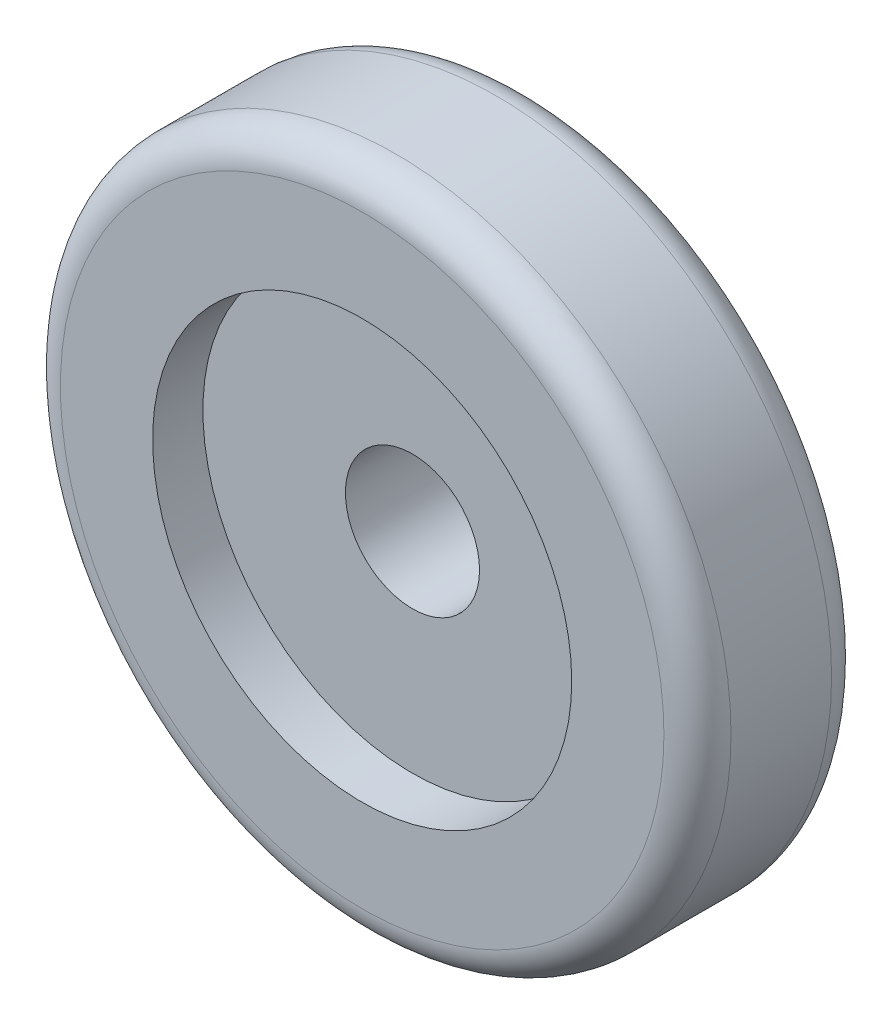
ISO-10303-21;
HEADER;
FILE_DESCRIPTION(('STEP AP214'),'2;1');
FILE_NAME('part.step','',(''),(''),'','','');
FILE_SCHEMA(('AUTOMOTIVE_DESIGN { 1 0 10303 214 1 1 1 1 }'));
ENDSEC;
DATA;
#1=APPLICATION_CONTEXT('core data for automotive mechanical design processes');
#2=APPLICATION_PROTOCOL_DEFINITION('international standard','automotive_design',2000,#1);
#3=PRODUCT_CONTEXT('',#1,'mechanical');
#4=PRODUCT('Part','Part','',(#3));
#5=PRODUCT_RELATED_PRODUCT_CATEGORY('part','',(#4));
#6=PRODUCT_DEFINITION_FORMATION('','',#4);
#7=PRODUCT_DEFINITION_CONTEXT('part definition',#1,'design');
#8=PRODUCT_DEFINITION('design','',#6,#7);
#9=PRODUCT_DEFINITION_SHAPE('','',#8);
#10=(LENGTH_UNIT() NAMED_UNIT(*) SI_UNIT(.MILLI.,.METRE.));
#11=(NAMED_UNIT(*) PLANE_ANGLE_UNIT() SI_UNIT($,.RADIAN.));
#12=(NAMED_UNIT(*) SI_UNIT($,.STERADIAN.) SOLID_ANGLE_UNIT());
#13=UNCERTAINTY_MEASURE_WITH_UNIT(LENGTH_MEASURE(1.E-05),#10,'distance_accuracy_value','');
#14=(GEOMETRIC_REPRESENTATION_CONTEXT(3) GLOBAL_UNCERTAINTY_ASSIGNED_CONTEXT((#13)) GLOBAL_UNIT_ASSIGNED_CONTEXT((#10,
#11,#12)) REPRESENTATION_CONTEXT('',''));
#15=CARTESIAN_POINT('',(0.,0.,0.));
#16=DIRECTION('',(0.,0.,1.));
#17=DIRECTION('',(1.,0.,0.));
#18=AXIS2_PLACEMENT_3D('',#15,#16,#17);
#19=CARTESIAN_POINT('',(0.,0.,10.));
#20=DIRECTION('',(0.,0.,-1.));
#21=DIRECTION('',(-1.,0.,0.));
#22=AXIS2_PLACEMENT_3D('',#19,#20,#21);
#23=CYLINDRICAL_SURFACE('',#22,4.);
#24=CARTESIAN_POINT('',(0.,0.,0.));
#25=DIRECTION('',(0.,0.,1.));
#26=DIRECTION('',(1.,0.,0.));
#27=AXIS2_PLACEMENT_3D('',#24,#25,#26);
#28=CIRCLE('',#27,4.);
#29=CARTESIAN_POINT('',(4.,0.,0.));
#30=VERTEX_POINT('',#29);
#31=EDGE_CURVE('E57',#30,#30,#28,.T.);
#32=ORIENTED_EDGE('',*,*,#31,.F.);
#33=EDGE_LOOP('',(#32));
#34=FACE_BOUND('',#33,.T.);
#35=CARTESIAN_POINT('',(0.,0.,7.));
#36=DIRECTION('',(0.,0.,1.));
#37=DIRECTION('',(1.,0.,0.));
#38=AXIS2_PLACEMENT_3D('',#35,#36,#37);
#39=CIRCLE('',#38,4.);
#40=CARTESIAN_POINT('',(4.,0.,7.));
#41=VERTEX_POINT('',#40);
#42=EDGE_CURVE('E58',#41,#41,#39,.T.);
#43=ORIENTED_EDGE('',*,*,#42,.T.);
#44=EDGE_LOOP('',(#43));
#45=FACE_BOUND('',#44,.T.);
#46=ADVANCED_FACE('F37',(#34,#45),#23,.F.);
#47=CARTESIAN_POINT('',(0.,0.,10.));
#48=DIRECTION('',(0.,0.,1.));
#49=DIRECTION('',(1.,0.,0.));
#50=AXIS2_PLACEMENT_3D('',#47,#48,#49);
#51=PLANE('',#50);
#52=CARTESIAN_POINT('',(0.,0.,10.));
#53=DIRECTION('',(0.,0.,1.));
#54=DIRECTION('',(1.,0.,0.));
#55=AXIS2_PLACEMENT_3D('',#52,#53,#54);
#56=CIRCLE('',#55,18.);
#57=CARTESIAN_POINT('',(18.,0.,10.));
#58=VERTEX_POINT('',#57);
#59=EDGE_CURVE('E10',#58,#58,#56,.T.);
#60=ORIENTED_EDGE('',*,*,#59,.T.);
#61=EDGE_LOOP('',(#60));
#62=FACE_BOUND('',#61,.T.);
#63=CARTESIAN_POINT('',(0.,0.,10.));
#64=DIRECTION('',(0.,0.,1.));
#65=DIRECTION('',(1.,0.,0.));
#66=AXIS2_PLACEMENT_3D('',#63,#64,#65);
#67=CIRCLE('',#66,12.5);
#68=CARTESIAN_POINT('',(12.5,0.,10.));
#69=VERTEX_POINT('',#68);
#70=EDGE_CURVE('E64',#69,#69,#67,.T.);
#71=ORIENTED_EDGE('',*,*,#70,.F.);
#72=EDGE_LOOP('',(#71));
#73=FACE_BOUND('',#72,.T.);
#74=ADVANCED_FACE('F79',(#62,#73),#51,.T.);
#75=CARTESIAN_POINT('',(0.,0.,0.));
#76=DIRECTION('',(0.,0.,1.));
#77=DIRECTION('',(1.,0.,0.));
#78=AXIS2_PLACEMENT_3D('',#75,#76,#77);
#79=PLANE('',#78);
#80=CARTESIAN_POINT('',(0.,0.,0.));
#81=DIRECTION('',(0.,0.,1.));
#82=DIRECTION('',(1.,0.,0.));
#83=AXIS2_PLACEMENT_3D('',#80,#81,#82);
#84=CIRCLE('',#83,18.);
#85=CARTESIAN_POINT('',(18.,0.,0.));
#86=VERTEX_POINT('',#85);
#87=EDGE_CURVE('E44',#86,#86,#84,.F.);
#88=ORIENTED_EDGE('',*,*,#87,.T.);
#89=EDGE_LOOP('',(#88));
#90=FACE_BOUND('',#89,.T.);
#91=ORIENTED_EDGE('',*,*,#31,.T.);
#92=EDGE_LOOP('',(#91));
#93=FACE_BOUND('',#92,.T.);
#94=ADVANCED_FACE('F81',(#90,#93),#79,.F.);
#95=CARTESIAN_POINT('',(0.,0.,10.));
#96=DIRECTION('',(0.,0.,-1.));
#97=DIRECTION('',(-1.,0.,0.));
#98=AXIS2_PLACEMENT_3D('',#95,#96,#97);
#99=CYLINDRICAL_SURFACE('',#98,20.);
#100=CARTESIAN_POINT('',(0.,0.,2.));
#101=DIRECTION('',(0.,0.,1.));
#102=DIRECTION('',(1.,0.,0.));
#103=AXIS2_PLACEMENT_3D('',#100,#101,#102);
#104=CIRCLE('',#103,20.);
#105=CARTESIAN_POINT('',(20.,0.,2.));
#106=VERTEX_POINT('',#105);
#107=EDGE_CURVE('E48',#106,#106,#104,.T.);
#108=ORIENTED_EDGE('',*,*,#107,.T.);
#109=EDGE_LOOP('',(#108));
#110=FACE_BOUND('',#109,.T.);
#111=CARTESIAN_POINT('',(0.,0.,8.));
#112=DIRECTION('',(0.,0.,1.));
#113=DIRECTION('',(1.,0.,0.));
#114=AXIS2_PLACEMENT_3D('',#111,#112,#113);
#115=CIRCLE('',#114,20.);
#116=CARTESIAN_POINT('',(20.,0.,8.));
#117=VERTEX_POINT('',#116);
#118=EDGE_CURVE('E52',#117,#117,#115,.F.);
#119=ORIENTED_EDGE('',*,*,#118,.T.);
#120=EDGE_LOOP('',(#119));
#121=FACE_BOUND('',#120,.T.);
#122=ADVANCED_FACE('F75',(#110,#121),#99,.T.);
#123=CARTESIAN_POINT('',(0.,0.,7.));
#124=DIRECTION('',(0.,0.,1.));
#125=DIRECTION('',(1.,0.,0.));
#126=AXIS2_PLACEMENT_3D('',#123,#124,#125);
#127=CYLINDRICAL_SURFACE('',#126,12.5);
#128=CARTESIAN_POINT('',(0.,0.,7.));
#129=DIRECTION('',(0.,0.,1.));
#130=DIRECTION('',(1.,0.,0.));
#131=AXIS2_PLACEMENT_3D('',#128,#129,#130);
#132=CIRCLE('',#131,12.5);
#133=CARTESIAN_POINT('',(12.5,0.,7.));
#134=VERTEX_POINT('',#133);
#135=EDGE_CURVE('E61',#134,#134,#132,.T.);
#136=ORIENTED_EDGE('',*,*,#135,.F.);
#137=EDGE_LOOP('',(#136));
#138=FACE_BOUND('',#137,.T.);
#139=ORIENTED_EDGE('',*,*,#70,.T.);
#140=EDGE_LOOP('',(#139));
#141=FACE_BOUND('',#140,.T.);
#142=ADVANCED_FACE('F72',(#138,#141),#127,.F.);
#143=CARTESIAN_POINT('',(0.,0.,7.));
#144=DIRECTION('',(0.,0.,1.));
#145=DIRECTION('',(1.,0.,0.));
#146=AXIS2_PLACEMENT_3D('',#143,#144,#145);
#147=PLANE('',#146);
#148=ORIENTED_EDGE('',*,*,#42,.F.);
#149=EDGE_LOOP('',(#148));
#150=FACE_BOUND('',#149,.T.);
#151=ORIENTED_EDGE('',*,*,#135,.T.);
#152=EDGE_LOOP('',(#151));
#153=FACE_BOUND('',#152,.T.);
#154=ADVANCED_FACE('F70',(#150,#153),#147,.T.);
#155=CARTESIAN_POINT('',(0.,0.,2.));
#156=DIRECTION('',(0.,0.,1.));
#157=DIRECTION('',(1.,0.,0.));
#158=AXIS2_PLACEMENT_3D('',#155,#156,#157);
#159=TOROIDAL_SURFACE('',#158,18.,2.);
#160=ORIENTED_EDGE('',*,*,#87,.F.);
#161=EDGE_LOOP('',(#160));
#162=FACE_BOUND('',#161,.T.);
#163=ORIENTED_EDGE('',*,*,#107,.F.);
#164=EDGE_LOOP('',(#163));
#165=FACE_BOUND('',#164,.T.);
#166=ADVANCED_FACE('F93',(#162,#165),#159,.T.);
#167=CARTESIAN_POINT('',(0.,0.,8.));
#168=DIRECTION('',(0.,0.,1.));
#169=DIRECTION('',(1.,0.,0.));
#170=AXIS2_PLACEMENT_3D('',#167,#168,#169);
#171=TOROIDAL_SURFACE('',#170,18.,2.);
#172=ORIENTED_EDGE('',*,*,#118,.F.);
#173=EDGE_LOOP('',(#172));
#174=FACE_BOUND('',#173,.T.);
#175=ORIENTED_EDGE('',*,*,#59,.F.);
#176=EDGE_LOOP('',(#175));
#177=FACE_BOUND('',#176,.T.);
#178=ADVANCED_FACE('F39',(#174,#177),#171,.T.);
#179=CLOSED_SHELL('',(#46,#74,#94,#122,#142,#154,#166,#178));
#180=MANIFOLD_SOLID_BREP('B2',#179);
#181=ADVANCED_BREP_SHAPE_REPRESENTATION('',(#18,#180),#14);
#182=SHAPE_DEFINITION_REPRESENTATION(#9,#181);
ENDSEC;
END-ISO-10303-21;
